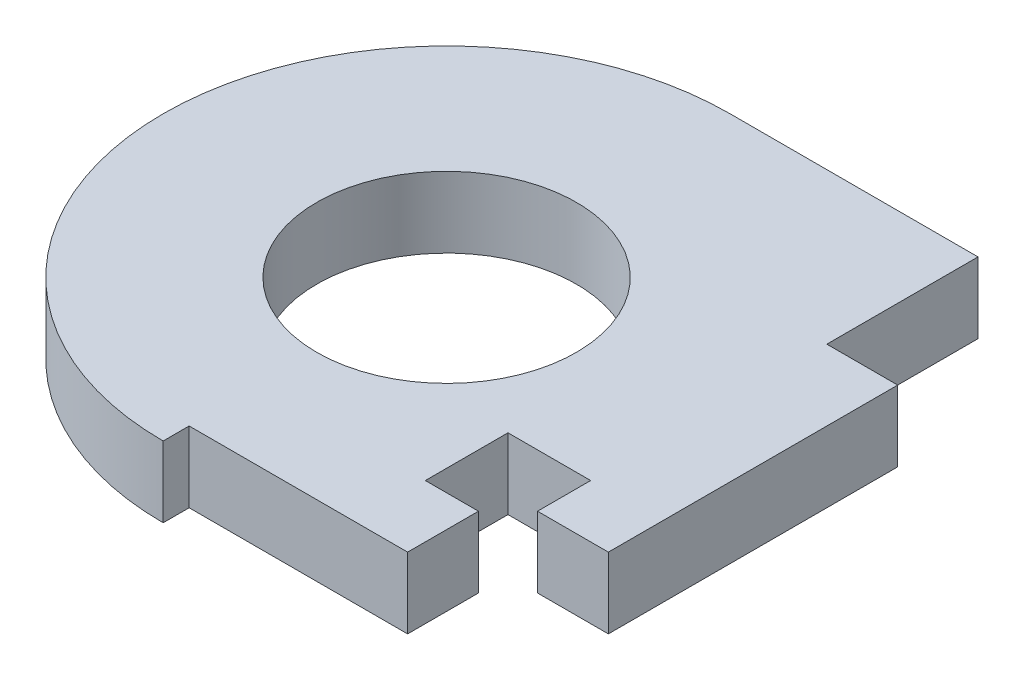
ISO-10303-21;
HEADER;
FILE_DESCRIPTION(('STEP AP214'),'2;1');
FILE_NAME('part.step','',(''),(''),'','','');
FILE_SCHEMA(('AUTOMOTIVE_DESIGN { 1 0 10303 214 1 1 1 1 }'));
ENDSEC;
DATA;
#1=APPLICATION_CONTEXT('core data for automotive mechanical design processes');
#2=APPLICATION_PROTOCOL_DEFINITION('international standard','automotive_design',2000,#1);
#3=PRODUCT_CONTEXT('',#1,'mechanical');
#4=PRODUCT('Part','Part','',(#3));
#5=PRODUCT_RELATED_PRODUCT_CATEGORY('part','',(#4));
#6=PRODUCT_DEFINITION_FORMATION('','',#4);
#7=PRODUCT_DEFINITION_CONTEXT('part definition',#1,'design');
#8=PRODUCT_DEFINITION('design','',#6,#7);
#9=PRODUCT_DEFINITION_SHAPE('','',#8);
#10=(LENGTH_UNIT() NAMED_UNIT(*) SI_UNIT(.MILLI.,.METRE.));
#11=(NAMED_UNIT(*) PLANE_ANGLE_UNIT() SI_UNIT($,.RADIAN.));
#12=(NAMED_UNIT(*) SI_UNIT($,.STERADIAN.) SOLID_ANGLE_UNIT());
#13=UNCERTAINTY_MEASURE_WITH_UNIT(LENGTH_MEASURE(1.E-05),#10,'distance_accuracy_value','');
#14=(GEOMETRIC_REPRESENTATION_CONTEXT(3) GLOBAL_UNCERTAINTY_ASSIGNED_CONTEXT((#13)) GLOBAL_UNIT_ASSIGNED_CONTEXT((#10,
#11,#12)) REPRESENTATION_CONTEXT('',''));
#15=CARTESIAN_POINT('',(0.,0.,0.));
#16=DIRECTION('',(0.,0.,1.));
#17=DIRECTION('',(1.,0.,0.));
#18=AXIS2_PLACEMENT_3D('',#15,#16,#17);
#19=CARTESIAN_POINT('',(-14.,6.,-15.8));
#20=DIRECTION('',(0.,1.,0.));
#21=DIRECTION('',(0.,0.,1.));
#22=AXIS2_PLACEMENT_3D('',#19,#20,#21);
#23=PLANE('',#22);
#24=DIRECTION('',(-1.,0.,0.));
#25=VECTOR('',#24,1.);
#26=CARTESIAN_POINT('',(0.,6.,0.));
#27=LINE('',#26,#25);
#28=CARTESIAN_POINT('',(4.5,6.,0.));
#29=VERTEX_POINT('',#28);
#30=CARTESIAN_POINT('',(0.,6.,0.));
#31=VERTEX_POINT('',#30);
#32=EDGE_CURVE('E187',#29,#31,#27,.T.);
#33=ORIENTED_EDGE('',*,*,#32,.T.);
#34=DIRECTION('',(0.,0.,-1.));
#35=VECTOR('',#34,1.);
#36=CARTESIAN_POINT('',(0.,6.,0.));
#37=LINE('',#36,#35);
#38=CARTESIAN_POINT('',(0.,6.,-7.));
#39=VERTEX_POINT('',#38);
#40=EDGE_CURVE('E110',#31,#39,#37,.T.);
#41=ORIENTED_EDGE('',*,*,#40,.T.);
#42=DIRECTION('',(1.,0.,0.));
#43=VECTOR('',#42,1.);
#44=CARTESIAN_POINT('',(0.,6.,-7.));
#45=LINE('',#44,#43);
#46=CARTESIAN_POINT('',(7.,6.,-7.));
#47=VERTEX_POINT('',#46);
#48=EDGE_CURVE('E217',#39,#47,#45,.T.);
#49=ORIENTED_EDGE('',*,*,#48,.T.);
#50=DIRECTION('',(0.,0.,1.));
#51=VECTOR('',#50,1.);
#52=CARTESIAN_POINT('',(7.,6.,-7.));
#53=LINE('',#52,#51);
#54=CARTESIAN_POINT('',(7.,6.,-2.5));
#55=VERTEX_POINT('',#54);
#56=EDGE_CURVE('E236',#47,#55,#53,.T.);
#57=ORIENTED_EDGE('',*,*,#56,.T.);
#58=DIRECTION('',(1.,0.,0.));
#59=VECTOR('',#58,1.);
#60=CARTESIAN_POINT('',(7.,6.,-2.5));
#61=LINE('',#60,#59);
#62=CARTESIAN_POINT('',(13.,6.,-2.5));
#63=VERTEX_POINT('',#62);
#64=EDGE_CURVE('E233',#55,#63,#61,.T.);
#65=ORIENTED_EDGE('',*,*,#64,.T.);
#66=DIRECTION('',(0.,0.,-1.));
#67=VECTOR('',#66,1.);
#68=CARTESIAN_POINT('',(13.,6.,-2.5));
#69=LINE('',#68,#67);
#70=CARTESIAN_POINT('',(13.,6.,-27.));
#71=VERTEX_POINT('',#70);
#72=EDGE_CURVE('E235',#63,#71,#69,.T.);
#73=ORIENTED_EDGE('',*,*,#72,.T.);
#74=DIRECTION('',(-1.,0.,0.));
#75=VECTOR('',#74,1.);
#76=CARTESIAN_POINT('',(7.,6.,-27.));
#77=LINE('',#76,#75);
#78=CARTESIAN_POINT('',(7.,6.,-27.));
#79=VERTEX_POINT('',#78);
#80=EDGE_CURVE('E238',#71,#79,#77,.T.);
#81=ORIENTED_EDGE('',*,*,#80,.T.);
#82=DIRECTION('',(0.,0.,-1.));
#83=VECTOR('',#82,1.);
#84=CARTESIAN_POINT('',(7.00000000000001,6.,-39.8));
#85=LINE('',#84,#83);
#86=CARTESIAN_POINT('',(7.00000000000001,6.,-39.8));
#87=VERTEX_POINT('',#86);
#88=EDGE_CURVE('E244',#79,#87,#85,.T.);
#89=ORIENTED_EDGE('',*,*,#88,.T.);
#90=DIRECTION('',(-1.,0.,0.));
#91=VECTOR('',#90,1.);
#92=CARTESIAN_POINT('',(-14.,6.,-39.8));
#93=LINE('',#92,#91);
#94=CARTESIAN_POINT('',(-14.,6.,-39.8));
#95=VERTEX_POINT('',#94);
#96=EDGE_CURVE('E246',#87,#95,#93,.T.);
#97=ORIENTED_EDGE('',*,*,#96,.T.);
#98=CARTESIAN_POINT('',(-14.,6.,-15.8));
#99=DIRECTION('',(0.,1.,0.));
#100=DIRECTION('',(0.,0.,1.));
#101=AXIS2_PLACEMENT_3D('',#98,#99,#100);
#102=CIRCLE('',#101,24.);
#103=CARTESIAN_POINT('',(-14.,6.,8.2));
#104=VERTEX_POINT('',#103);
#105=EDGE_CURVE('E144',#95,#104,#102,.T.);
#106=ORIENTED_EDGE('',*,*,#105,.T.);
#107=DIRECTION('',(0.,0.,-1.));
#108=VECTOR('',#107,1.);
#109=CARTESIAN_POINT('',(-14.,6.,8.2));
#110=LINE('',#109,#108);
#111=CARTESIAN_POINT('',(-14.,6.,6.));
#112=VERTEX_POINT('',#111);
#113=EDGE_CURVE('E138',#104,#112,#110,.T.);
#114=ORIENTED_EDGE('',*,*,#113,.T.);
#115=DIRECTION('',(1.,0.,0.));
#116=VECTOR('',#115,1.);
#117=CARTESIAN_POINT('',(-14.,6.,6.));
#118=LINE('',#117,#116);
#119=CARTESIAN_POINT('',(4.50000000000001,6.,6.));
#120=VERTEX_POINT('',#119);
#121=EDGE_CURVE('E142',#112,#120,#118,.T.);
#122=ORIENTED_EDGE('',*,*,#121,.T.);
#123=DIRECTION('',(0.,0.,-1.));
#124=VECTOR('',#123,1.);
#125=CARTESIAN_POINT('',(4.5,6.,0.));
#126=LINE('',#125,#124);
#127=EDGE_CURVE('E52',#120,#29,#126,.T.);
#128=ORIENTED_EDGE('',*,*,#127,.T.);
#129=EDGE_LOOP('',(#33,#41,#49,#57,#65,#73,#81,#89,#97,#106,#114,#122,#128));
#130=FACE_BOUND('',#129,.T.);
#131=CARTESIAN_POINT('',(-14.,6.,-15.8));
#132=DIRECTION('',(0.,1.,0.));
#133=DIRECTION('',(0.,0.,1.));
#134=AXIS2_PLACEMENT_3D('',#131,#132,#133);
#135=CIRCLE('',#134,11.);
#136=CARTESIAN_POINT('',(-14.,6.,-4.8));
#137=VERTEX_POINT('',#136);
#138=EDGE_CURVE('E166',#137,#137,#135,.T.);
#139=ORIENTED_EDGE('',*,*,#138,.F.);
#140=EDGE_LOOP('',(#139));
#141=FACE_BOUND('',#140,.T.);
#142=ADVANCED_FACE('F35',(#130,#141),#23,.T.);
#143=CARTESIAN_POINT('',(-14.,0.,-15.8));
#144=DIRECTION('',(0.,1.,0.));
#145=DIRECTION('',(0.,0.,1.));
#146=AXIS2_PLACEMENT_3D('',#143,#144,#145);
#147=PLANE('',#146);
#148=DIRECTION('',(-1.,0.,0.));
#149=VECTOR('',#148,1.);
#150=CARTESIAN_POINT('',(0.,0.,0.));
#151=LINE('',#150,#149);
#152=CARTESIAN_POINT('',(4.5,0.,0.));
#153=VERTEX_POINT('',#152);
#154=CARTESIAN_POINT('',(0.,0.,0.));
#155=VERTEX_POINT('',#154);
#156=EDGE_CURVE('E162',#153,#155,#151,.T.);
#157=ORIENTED_EDGE('',*,*,#156,.F.);
#158=DIRECTION('',(0.,0.,-1.));
#159=VECTOR('',#158,1.);
#160=CARTESIAN_POINT('',(4.5,0.,0.));
#161=LINE('',#160,#159);
#162=CARTESIAN_POINT('',(4.50000000000001,0.,6.));
#163=VERTEX_POINT('',#162);
#164=EDGE_CURVE('E102',#163,#153,#161,.T.);
#165=ORIENTED_EDGE('',*,*,#164,.F.);
#166=DIRECTION('',(1.,0.,0.));
#167=VECTOR('',#166,1.);
#168=CARTESIAN_POINT('',(-14.,0.,6.));
#169=LINE('',#168,#167);
#170=CARTESIAN_POINT('',(-14.,0.,6.));
#171=VERTEX_POINT('',#170);
#172=EDGE_CURVE('E96',#171,#163,#169,.T.);
#173=ORIENTED_EDGE('',*,*,#172,.F.);
#174=DIRECTION('',(0.,0.,-1.));
#175=VECTOR('',#174,1.);
#176=CARTESIAN_POINT('',(-14.,0.,8.2));
#177=LINE('',#176,#175);
#178=CARTESIAN_POINT('',(-14.,0.,8.2));
#179=VERTEX_POINT('',#178);
#180=EDGE_CURVE('E152',#179,#171,#177,.T.);
#181=ORIENTED_EDGE('',*,*,#180,.F.);
#182=CARTESIAN_POINT('',(-14.,0.,-15.8));
#183=DIRECTION('',(0.,1.,0.));
#184=DIRECTION('',(0.,0.,1.));
#185=AXIS2_PLACEMENT_3D('',#182,#183,#184);
#186=CIRCLE('',#185,24.);
#187=CARTESIAN_POINT('',(-14.,0.,-39.8));
#188=VERTEX_POINT('',#187);
#189=EDGE_CURVE('E182',#188,#179,#186,.T.);
#190=ORIENTED_EDGE('',*,*,#189,.F.);
#191=DIRECTION('',(-1.,0.,0.));
#192=VECTOR('',#191,1.);
#193=CARTESIAN_POINT('',(-14.,0.,-39.8));
#194=LINE('',#193,#192);
#195=CARTESIAN_POINT('',(7.00000000000001,0.,-39.8));
#196=VERTEX_POINT('',#195);
#197=EDGE_CURVE('E180',#196,#188,#194,.T.);
#198=ORIENTED_EDGE('',*,*,#197,.F.);
#199=DIRECTION('',(0.,0.,-1.));
#200=VECTOR('',#199,1.);
#201=CARTESIAN_POINT('',(7.00000000000001,0.,-39.8));
#202=LINE('',#201,#200);
#203=CARTESIAN_POINT('',(7.,0.,-27.));
#204=VERTEX_POINT('',#203);
#205=EDGE_CURVE('E178',#204,#196,#202,.T.);
#206=ORIENTED_EDGE('',*,*,#205,.F.);
#207=DIRECTION('',(-1.,0.,0.));
#208=VECTOR('',#207,1.);
#209=CARTESIAN_POINT('',(7.,0.,-27.));
#210=LINE('',#209,#208);
#211=CARTESIAN_POINT('',(13.,0.,-27.));
#212=VERTEX_POINT('',#211);
#213=EDGE_CURVE('E176',#212,#204,#210,.T.);
#214=ORIENTED_EDGE('',*,*,#213,.F.);
#215=DIRECTION('',(0.,0.,-1.));
#216=VECTOR('',#215,1.);
#217=CARTESIAN_POINT('',(13.,0.,-2.5));
#218=LINE('',#217,#216);
#219=CARTESIAN_POINT('',(13.,0.,-2.5));
#220=VERTEX_POINT('',#219);
#221=EDGE_CURVE('E174',#220,#212,#218,.T.);
#222=ORIENTED_EDGE('',*,*,#221,.F.);
#223=DIRECTION('',(1.,0.,0.));
#224=VECTOR('',#223,1.);
#225=CARTESIAN_POINT('',(7.,0.,-2.5));
#226=LINE('',#225,#224);
#227=CARTESIAN_POINT('',(7.,0.,-2.5));
#228=VERTEX_POINT('',#227);
#229=EDGE_CURVE('E172',#228,#220,#226,.T.);
#230=ORIENTED_EDGE('',*,*,#229,.F.);
#231=DIRECTION('',(0.,0.,1.));
#232=VECTOR('',#231,1.);
#233=CARTESIAN_POINT('',(7.,0.,-7.));
#234=LINE('',#233,#232);
#235=CARTESIAN_POINT('',(7.,0.,-7.));
#236=VERTEX_POINT('',#235);
#237=EDGE_CURVE('E170',#236,#228,#234,.T.);
#238=ORIENTED_EDGE('',*,*,#237,.F.);
#239=DIRECTION('',(1.,0.,0.));
#240=VECTOR('',#239,1.);
#241=CARTESIAN_POINT('',(0.,0.,-7.));
#242=LINE('',#241,#240);
#243=CARTESIAN_POINT('',(0.,0.,-7.));
#244=VERTEX_POINT('',#243);
#245=EDGE_CURVE('E168',#244,#236,#242,.T.);
#246=ORIENTED_EDGE('',*,*,#245,.F.);
#247=DIRECTION('',(0.,0.,-1.));
#248=VECTOR('',#247,1.);
#249=CARTESIAN_POINT('',(0.,0.,0.));
#250=LINE('',#249,#248);
#251=EDGE_CURVE('E165',#155,#244,#250,.T.);
#252=ORIENTED_EDGE('',*,*,#251,.F.);
#253=EDGE_LOOP('',(#157,#165,#173,#181,#190,#198,#206,#214,#222,#230,#238,#246,#252));
#254=FACE_BOUND('',#253,.T.);
#255=CARTESIAN_POINT('',(-14.,0.,-15.8));
#256=DIRECTION('',(0.,1.,0.));
#257=DIRECTION('',(0.,0.,1.));
#258=AXIS2_PLACEMENT_3D('',#255,#256,#257);
#259=CIRCLE('',#258,11.);
#260=CARTESIAN_POINT('',(-14.,0.,-4.8));
#261=VERTEX_POINT('',#260);
#262=EDGE_CURVE('E406',#261,#261,#259,.T.);
#263=ORIENTED_EDGE('',*,*,#262,.T.);
#264=EDGE_LOOP('',(#263));
#265=FACE_BOUND('',#264,.T.);
#266=ADVANCED_FACE('F221',(#254,#265),#147,.F.);
#267=CARTESIAN_POINT('',(0.,6.,0.));
#268=DIRECTION('',(0.,0.,1.));
#269=DIRECTION('',(1.,0.,0.));
#270=AXIS2_PLACEMENT_3D('',#267,#268,#269);
#271=PLANE('',#270);
#272=ORIENTED_EDGE('',*,*,#156,.T.);
#273=DIRECTION('',(0.,-1.,0.));
#274=VECTOR('',#273,1.);
#275=CARTESIAN_POINT('',(0.,6.,0.));
#276=LINE('',#275,#274);
#277=EDGE_CURVE('E11',#31,#155,#276,.T.);
#278=ORIENTED_EDGE('',*,*,#277,.F.);
#279=ORIENTED_EDGE('',*,*,#32,.F.);
#280=DIRECTION('',(0.,-1.,0.));
#281=VECTOR('',#280,1.);
#282=CARTESIAN_POINT('',(4.5,6.,0.));
#283=LINE('',#282,#281);
#284=EDGE_CURVE('E158',#29,#153,#283,.T.);
#285=ORIENTED_EDGE('',*,*,#284,.T.);
#286=EDGE_LOOP('',(#272,#278,#279,#285));
#287=FACE_BOUND('',#286,.T.);
#288=ADVANCED_FACE('F37',(#287),#271,.F.);
#289=CARTESIAN_POINT('',(0.,6.,0.));
#290=DIRECTION('',(-1.,0.,0.));
#291=DIRECTION('',(0.,0.,1.));
#292=AXIS2_PLACEMENT_3D('',#289,#290,#291);
#293=PLANE('',#292);
#294=ORIENTED_EDGE('',*,*,#251,.T.);
#295=DIRECTION('',(0.,-1.,0.));
#296=VECTOR('',#295,1.);
#297=CARTESIAN_POINT('',(0.,6.,-7.));
#298=LINE('',#297,#296);
#299=EDGE_CURVE('E44',#39,#244,#298,.T.);
#300=ORIENTED_EDGE('',*,*,#299,.F.);
#301=ORIENTED_EDGE('',*,*,#40,.F.);
#302=ORIENTED_EDGE('',*,*,#277,.T.);
#303=EDGE_LOOP('',(#294,#300,#301,#302));
#304=FACE_BOUND('',#303,.T.);
#305=ADVANCED_FACE('F280',(#304),#293,.F.);
#306=CARTESIAN_POINT('',(0.,6.,-7.));
#307=DIRECTION('',(0.,0.,-1.));
#308=DIRECTION('',(-1.,0.,0.));
#309=AXIS2_PLACEMENT_3D('',#306,#307,#308);
#310=PLANE('',#309);
#311=ORIENTED_EDGE('',*,*,#245,.T.);
#312=DIRECTION('',(0.,-1.,0.));
#313=VECTOR('',#312,1.);
#314=CARTESIAN_POINT('',(7.,6.,-7.));
#315=LINE('',#314,#313);
#316=EDGE_CURVE('E209',#47,#236,#315,.T.);
#317=ORIENTED_EDGE('',*,*,#316,.F.);
#318=ORIENTED_EDGE('',*,*,#48,.F.);
#319=ORIENTED_EDGE('',*,*,#299,.T.);
#320=EDGE_LOOP('',(#311,#317,#318,#319));
#321=FACE_BOUND('',#320,.T.);
#322=ADVANCED_FACE('F215',(#321),#310,.F.);
#323=CARTESIAN_POINT('',(7.,6.,-7.));
#324=DIRECTION('',(1.,0.,0.));
#325=DIRECTION('',(0.,0.,-1.));
#326=AXIS2_PLACEMENT_3D('',#323,#324,#325);
#327=PLANE('',#326);
#328=ORIENTED_EDGE('',*,*,#237,.T.);
#329=DIRECTION('',(0.,-1.,0.));
#330=VECTOR('',#329,1.);
#331=CARTESIAN_POINT('',(7.,6.,-2.5));
#332=LINE('',#331,#330);
#333=EDGE_CURVE('E206',#55,#228,#332,.T.);
#334=ORIENTED_EDGE('',*,*,#333,.F.);
#335=ORIENTED_EDGE('',*,*,#56,.F.);
#336=ORIENTED_EDGE('',*,*,#316,.T.);
#337=EDGE_LOOP('',(#328,#334,#335,#336));
#338=FACE_BOUND('',#337,.T.);
#339=ADVANCED_FACE('F227',(#338),#327,.F.);
#340=CARTESIAN_POINT('',(7.,6.,-2.5));
#341=DIRECTION('',(0.,0.,-1.));
#342=DIRECTION('',(-1.,0.,0.));
#343=AXIS2_PLACEMENT_3D('',#340,#341,#342);
#344=PLANE('',#343);
#345=ORIENTED_EDGE('',*,*,#229,.T.);
#346=DIRECTION('',(0.,-1.,0.));
#347=VECTOR('',#346,1.);
#348=CARTESIAN_POINT('',(13.,6.,-2.5));
#349=LINE('',#348,#347);
#350=EDGE_CURVE('E203',#63,#220,#349,.T.);
#351=ORIENTED_EDGE('',*,*,#350,.F.);
#352=ORIENTED_EDGE('',*,*,#64,.F.);
#353=ORIENTED_EDGE('',*,*,#333,.T.);
#354=EDGE_LOOP('',(#345,#351,#352,#353));
#355=FACE_BOUND('',#354,.T.);
#356=ADVANCED_FACE('F231',(#355),#344,.F.);
#357=CARTESIAN_POINT('',(13.,6.,-2.5));
#358=DIRECTION('',(-1.,0.,0.));
#359=DIRECTION('',(0.,0.,1.));
#360=AXIS2_PLACEMENT_3D('',#357,#358,#359);
#361=PLANE('',#360);
#362=ORIENTED_EDGE('',*,*,#221,.T.);
#363=DIRECTION('',(0.,-1.,0.));
#364=VECTOR('',#363,1.);
#365=CARTESIAN_POINT('',(13.,6.,-27.));
#366=LINE('',#365,#364);
#367=EDGE_CURVE('E200',#71,#212,#366,.T.);
#368=ORIENTED_EDGE('',*,*,#367,.F.);
#369=ORIENTED_EDGE('',*,*,#72,.F.);
#370=ORIENTED_EDGE('',*,*,#350,.T.);
#371=EDGE_LOOP('',(#362,#368,#369,#370));
#372=FACE_BOUND('',#371,.T.);
#373=ADVANCED_FACE('F293',(#372),#361,.F.);
#374=CARTESIAN_POINT('',(7.,6.,-27.));
#375=DIRECTION('',(0.,0.,1.));
#376=DIRECTION('',(1.,0.,0.));
#377=AXIS2_PLACEMENT_3D('',#374,#375,#376);
#378=PLANE('',#377);
#379=ORIENTED_EDGE('',*,*,#213,.T.);
#380=DIRECTION('',(0.,-1.,0.));
#381=VECTOR('',#380,1.);
#382=CARTESIAN_POINT('',(7.,6.,-27.));
#383=LINE('',#382,#381);
#384=EDGE_CURVE('E197',#79,#204,#383,.T.);
#385=ORIENTED_EDGE('',*,*,#384,.F.);
#386=ORIENTED_EDGE('',*,*,#80,.F.);
#387=ORIENTED_EDGE('',*,*,#367,.T.);
#388=EDGE_LOOP('',(#379,#385,#386,#387));
#389=FACE_BOUND('',#388,.T.);
#390=ADVANCED_FACE('F296',(#389),#378,.F.);
#391=CARTESIAN_POINT('',(7.00000000000001,6.,-39.8));
#392=DIRECTION('',(-1.,0.,0.));
#393=DIRECTION('',(0.,0.,1.));
#394=AXIS2_PLACEMENT_3D('',#391,#392,#393);
#395=PLANE('',#394);
#396=ORIENTED_EDGE('',*,*,#205,.T.);
#397=DIRECTION('',(0.,-1.,0.));
#398=VECTOR('',#397,1.);
#399=CARTESIAN_POINT('',(7.00000000000001,6.,-39.8));
#400=LINE('',#399,#398);
#401=EDGE_CURVE('E194',#87,#196,#400,.T.);
#402=ORIENTED_EDGE('',*,*,#401,.F.);
#403=ORIENTED_EDGE('',*,*,#88,.F.);
#404=ORIENTED_EDGE('',*,*,#384,.T.);
#405=EDGE_LOOP('',(#396,#402,#403,#404));
#406=FACE_BOUND('',#405,.T.);
#407=ADVANCED_FACE('F300',(#406),#395,.F.);
#408=CARTESIAN_POINT('',(-14.,6.,-39.8));
#409=DIRECTION('',(0.,0.,1.));
#410=DIRECTION('',(1.,0.,0.));
#411=AXIS2_PLACEMENT_3D('',#408,#409,#410);
#412=PLANE('',#411);
#413=ORIENTED_EDGE('',*,*,#197,.T.);
#414=DIRECTION('',(0.,-1.,0.));
#415=VECTOR('',#414,1.);
#416=CARTESIAN_POINT('',(-14.,6.,-39.8));
#417=LINE('',#416,#415);
#418=EDGE_CURVE('E191',#95,#188,#417,.T.);
#419=ORIENTED_EDGE('',*,*,#418,.F.);
#420=ORIENTED_EDGE('',*,*,#96,.F.);
#421=ORIENTED_EDGE('',*,*,#401,.T.);
#422=EDGE_LOOP('',(#413,#419,#420,#421));
#423=FACE_BOUND('',#422,.T.);
#424=ADVANCED_FACE('F252',(#423),#412,.F.);
#425=CARTESIAN_POINT('',(-14.,6.,-15.8));
#426=DIRECTION('',(0.,-1.,0.));
#427=DIRECTION('',(0.,0.,-1.));
#428=AXIS2_PLACEMENT_3D('',#425,#426,#427);
#429=CYLINDRICAL_SURFACE('',#428,24.);
#430=ORIENTED_EDGE('',*,*,#189,.T.);
#431=DIRECTION('',(0.,-1.,0.));
#432=VECTOR('',#431,1.);
#433=CARTESIAN_POINT('',(-14.,6.,8.2));
#434=LINE('',#433,#432);
#435=EDGE_CURVE('E153',#104,#179,#434,.T.);
#436=ORIENTED_EDGE('',*,*,#435,.F.);
#437=ORIENTED_EDGE('',*,*,#105,.F.);
#438=ORIENTED_EDGE('',*,*,#418,.T.);
#439=EDGE_LOOP('',(#430,#436,#437,#438));
#440=FACE_BOUND('',#439,.T.);
#441=ADVANCED_FACE('F256',(#440),#429,.T.);
#442=CARTESIAN_POINT('',(-14.,6.,8.2));
#443=DIRECTION('',(-1.,0.,0.));
#444=DIRECTION('',(0.,0.,1.));
#445=AXIS2_PLACEMENT_3D('',#442,#443,#444);
#446=PLANE('',#445);
#447=ORIENTED_EDGE('',*,*,#180,.T.);
#448=DIRECTION('',(0.,-1.,0.));
#449=VECTOR('',#448,1.);
#450=CARTESIAN_POINT('',(-14.,6.,6.));
#451=LINE('',#450,#449);
#452=EDGE_CURVE('E149',#112,#171,#451,.T.);
#453=ORIENTED_EDGE('',*,*,#452,.F.);
#454=ORIENTED_EDGE('',*,*,#113,.F.);
#455=ORIENTED_EDGE('',*,*,#435,.T.);
#456=EDGE_LOOP('',(#447,#453,#454,#455));
#457=FACE_BOUND('',#456,.T.);
#458=ADVANCED_FACE('F150',(#457),#446,.F.);
#459=CARTESIAN_POINT('',(-14.,6.,6.));
#460=DIRECTION('',(0.,0.,-1.));
#461=DIRECTION('',(-1.,0.,0.));
#462=AXIS2_PLACEMENT_3D('',#459,#460,#461);
#463=PLANE('',#462);
#464=ORIENTED_EDGE('',*,*,#172,.T.);
#465=DIRECTION('',(0.,-1.,0.));
#466=VECTOR('',#465,1.);
#467=CARTESIAN_POINT('',(4.50000000000001,6.,6.));
#468=LINE('',#467,#466);
#469=EDGE_CURVE('E154',#120,#163,#468,.T.);
#470=ORIENTED_EDGE('',*,*,#469,.F.);
#471=ORIENTED_EDGE('',*,*,#121,.F.);
#472=ORIENTED_EDGE('',*,*,#452,.T.);
#473=EDGE_LOOP('',(#464,#470,#471,#472));
#474=FACE_BOUND('',#473,.T.);
#475=ADVANCED_FACE('F156',(#474),#463,.F.);
#476=CARTESIAN_POINT('',(4.5,6.,0.));
#477=DIRECTION('',(-1.,0.,0.));
#478=DIRECTION('',(0.,0.,1.));
#479=AXIS2_PLACEMENT_3D('',#476,#477,#478);
#480=PLANE('',#479);
#481=ORIENTED_EDGE('',*,*,#164,.T.);
#482=ORIENTED_EDGE('',*,*,#284,.F.);
#483=ORIENTED_EDGE('',*,*,#127,.F.);
#484=ORIENTED_EDGE('',*,*,#469,.T.);
#485=EDGE_LOOP('',(#481,#482,#483,#484));
#486=FACE_BOUND('',#485,.T.);
#487=ADVANCED_FACE('F260',(#486),#480,.F.);
#488=CARTESIAN_POINT('',(-14.,6.,-15.8));
#489=DIRECTION('',(0.,-1.,0.));
#490=DIRECTION('',(0.,0.,-1.));
#491=AXIS2_PLACEMENT_3D('',#488,#489,#490);
#492=CYLINDRICAL_SURFACE('',#491,11.);
#493=ORIENTED_EDGE('',*,*,#138,.T.);
#494=EDGE_LOOP('',(#493));
#495=FACE_BOUND('',#494,.T.);
#496=ORIENTED_EDGE('',*,*,#262,.F.);
#497=EDGE_LOOP('',(#496));
#498=FACE_BOUND('',#497,.T.);
#499=ADVANCED_FACE('F262',(#495,#498),#492,.F.);
#500=CLOSED_SHELL('',(#142,#266,#288,#305,#322,#339,#356,#373,#390,#407,#424,#441,#458,#475,
#487,#499));
#501=MANIFOLD_SOLID_BREP('B2',#500);
#502=ADVANCED_BREP_SHAPE_REPRESENTATION('',(#18,#501),#14);
#503=SHAPE_DEFINITION_REPRESENTATION(#9,#502);
ENDSEC;
END-ISO-10303-21;
